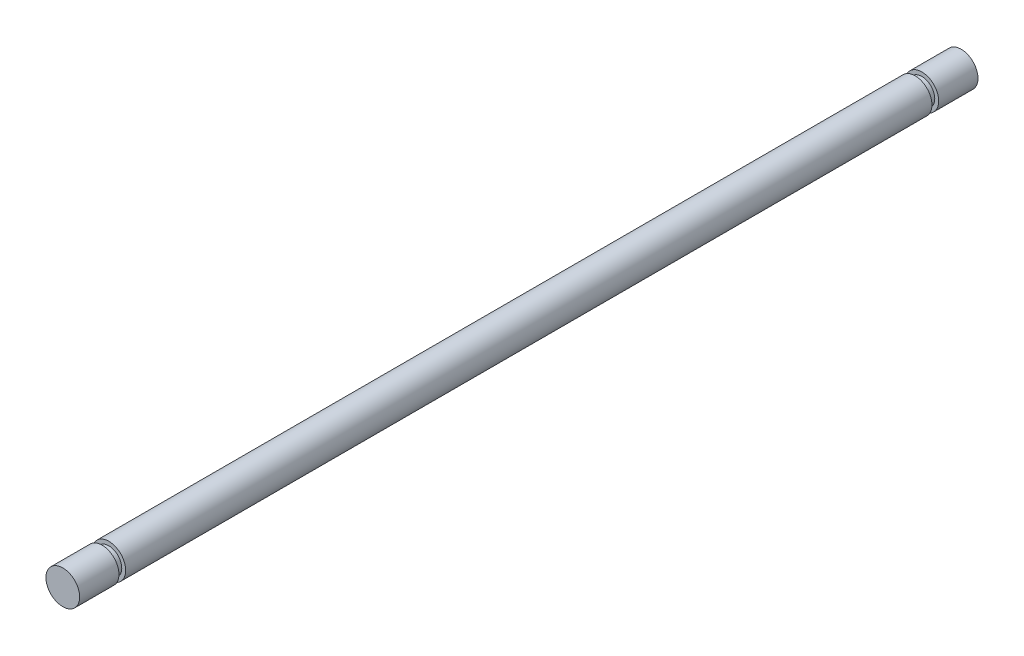
ISO-10303-21;
HEADER;
FILE_DESCRIPTION(('STEP AP214'),'2;1');
FILE_NAME('part.step','',(''),(''),'','','');
FILE_SCHEMA(('AUTOMOTIVE_DESIGN { 1 0 10303 214 1 1 1 1 }'));
ENDSEC;
DATA;
#1=APPLICATION_CONTEXT('core data for automotive mechanical design processes');
#2=APPLICATION_PROTOCOL_DEFINITION('international standard','automotive_design',2000,#1);
#3=PRODUCT_CONTEXT('',#1,'mechanical');
#4=PRODUCT('Part','Part','',(#3));
#5=PRODUCT_RELATED_PRODUCT_CATEGORY('part','',(#4));
#6=PRODUCT_DEFINITION_FORMATION('','',#4);
#7=PRODUCT_DEFINITION_CONTEXT('part definition',#1,'design');
#8=PRODUCT_DEFINITION('design','',#6,#7);
#9=PRODUCT_DEFINITION_SHAPE('','',#8);
#10=(LENGTH_UNIT() NAMED_UNIT(*) SI_UNIT(.MILLI.,.METRE.));
#11=(NAMED_UNIT(*) PLANE_ANGLE_UNIT() SI_UNIT($,.RADIAN.));
#12=(NAMED_UNIT(*) SI_UNIT($,.STERADIAN.) SOLID_ANGLE_UNIT());
#13=UNCERTAINTY_MEASURE_WITH_UNIT(LENGTH_MEASURE(1.E-05),#10,'distance_accuracy_value','');
#14=(GEOMETRIC_REPRESENTATION_CONTEXT(3) GLOBAL_UNCERTAINTY_ASSIGNED_CONTEXT((#13)) GLOBAL_UNIT_ASSIGNED_CONTEXT((#10,
#11,#12)) REPRESENTATION_CONTEXT('',''));
#15=CARTESIAN_POINT('',(0.,0.,0.));
#16=DIRECTION('',(0.,0.,1.));
#17=DIRECTION('',(1.,0.,0.));
#18=AXIS2_PLACEMENT_3D('',#15,#16,#17);
#19=CARTESIAN_POINT('',(0.,0.,3.5));
#20=DIRECTION('',(0.,0.,-1.));
#21=DIRECTION('',(-1.,0.,0.));
#22=AXIS2_PLACEMENT_3D('',#19,#20,#21);
#23=CYLINDRICAL_SURFACE('',#22,1.5);
#24=CARTESIAN_POINT('',(0.,0.,3.5));
#25=DIRECTION('',(0.,0.,1.));
#26=DIRECTION('',(1.,0.,0.));
#27=AXIS2_PLACEMENT_3D('',#24,#25,#26);
#28=CIRCLE('',#27,1.5);
#29=CARTESIAN_POINT('',(1.5,0.,3.5));
#30=VERTEX_POINT('',#29);
#31=EDGE_CURVE('E59',#30,#30,#28,.T.);
#32=ORIENTED_EDGE('',*,*,#31,.F.);
#33=EDGE_LOOP('',(#32));
#34=FACE_BOUND('',#33,.T.);
#35=CARTESIAN_POINT('',(0.,0.,0.));
#36=DIRECTION('',(0.,0.,1.));
#37=DIRECTION('',(1.,0.,0.));
#38=AXIS2_PLACEMENT_3D('',#35,#36,#37);
#39=CIRCLE('',#38,1.5);
#40=CARTESIAN_POINT('',(1.5,0.,0.));
#41=VERTEX_POINT('',#40);
#42=EDGE_CURVE('E47',#41,#41,#39,.T.);
#43=ORIENTED_EDGE('',*,*,#42,.T.);
#44=EDGE_LOOP('',(#43));
#45=FACE_BOUND('',#44,.T.);
#46=ADVANCED_FACE('F44',(#34,#45),#23,.T.);
#47=CARTESIAN_POINT('',(0.,0.,3.5));
#48=DIRECTION('',(0.,0.,1.));
#49=DIRECTION('',(1.,0.,0.));
#50=AXIS2_PLACEMENT_3D('',#47,#48,#49);
#51=PLANE('',#50);
#52=CARTESIAN_POINT('',(0.,0.,3.5));
#53=DIRECTION('',(0.,0.,1.));
#54=DIRECTION('',(1.,0.,0.));
#55=AXIS2_PLACEMENT_3D('',#52,#53,#54);
#56=CIRCLE('',#55,1.15);
#57=CARTESIAN_POINT('',(1.15,0.,3.5));
#58=VERTEX_POINT('',#57);
#59=EDGE_CURVE('E52',#58,#58,#56,.T.);
#60=ORIENTED_EDGE('',*,*,#59,.F.);
#61=EDGE_LOOP('',(#60));
#62=FACE_BOUND('',#61,.T.);
#63=ORIENTED_EDGE('',*,*,#31,.T.);
#64=EDGE_LOOP('',(#63));
#65=FACE_BOUND('',#64,.T.);
#66=ADVANCED_FACE('F81',(#62,#65),#51,.T.);
#67=CARTESIAN_POINT('',(0.,0.,0.));
#68=DIRECTION('',(0.,0.,1.));
#69=DIRECTION('',(1.,0.,0.));
#70=AXIS2_PLACEMENT_3D('',#67,#68,#69);
#71=PLANE('',#70);
#72=ORIENTED_EDGE('',*,*,#42,.F.);
#73=EDGE_LOOP('',(#72));
#74=FACE_BOUND('',#73,.T.);
#75=ADVANCED_FACE('F79',(#74),#71,.F.);
#76=CARTESIAN_POINT('',(0.,0.,4.1));
#77=DIRECTION('',(0.,0.,-1.));
#78=DIRECTION('',(-1.,0.,0.));
#79=AXIS2_PLACEMENT_3D('',#76,#77,#78);
#80=CYLINDRICAL_SURFACE('',#79,1.15);
#81=CARTESIAN_POINT('',(0.,0.,4.1));
#82=DIRECTION('',(0.,0.,1.));
#83=DIRECTION('',(1.,0.,0.));
#84=AXIS2_PLACEMENT_3D('',#81,#82,#83);
#85=CIRCLE('',#84,1.15);
#86=CARTESIAN_POINT('',(1.15,0.,4.1));
#87=VERTEX_POINT('',#86);
#88=EDGE_CURVE('E69',#87,#87,#85,.T.);
#89=ORIENTED_EDGE('',*,*,#88,.F.);
#90=EDGE_LOOP('',(#89));
#91=FACE_BOUND('',#90,.T.);
#92=ORIENTED_EDGE('',*,*,#59,.T.);
#93=EDGE_LOOP('',(#92));
#94=FACE_BOUND('',#93,.T.);
#95=ADVANCED_FACE('F84',(#91,#94),#80,.T.);
#96=CARTESIAN_POINT('',(0.,0.,75.9));
#97=DIRECTION('',(0.,0.,-1.));
#98=DIRECTION('',(-1.,0.,0.));
#99=AXIS2_PLACEMENT_3D('',#96,#97,#98);
#100=CYLINDRICAL_SURFACE('',#99,1.5);
#101=CARTESIAN_POINT('',(0.,0.,75.9));
#102=DIRECTION('',(0.,0.,1.));
#103=DIRECTION('',(1.,0.,0.));
#104=AXIS2_PLACEMENT_3D('',#101,#102,#103);
#105=CIRCLE('',#104,1.5);
#106=CARTESIAN_POINT('',(1.5,0.,75.9));
#107=VERTEX_POINT('',#106);
#108=EDGE_CURVE('E63',#107,#107,#105,.T.);
#109=ORIENTED_EDGE('',*,*,#108,.F.);
#110=EDGE_LOOP('',(#109));
#111=FACE_BOUND('',#110,.T.);
#112=CARTESIAN_POINT('',(0.,0.,4.1));
#113=DIRECTION('',(0.,0.,1.));
#114=DIRECTION('',(1.,0.,0.));
#115=AXIS2_PLACEMENT_3D('',#112,#113,#114);
#116=CIRCLE('',#115,1.5);
#117=CARTESIAN_POINT('',(1.5,0.,4.1));
#118=VERTEX_POINT('',#117);
#119=EDGE_CURVE('E70',#118,#118,#116,.T.);
#120=ORIENTED_EDGE('',*,*,#119,.T.);
#121=EDGE_LOOP('',(#120));
#122=FACE_BOUND('',#121,.T.);
#123=ADVANCED_FACE('F87',(#111,#122),#100,.T.);
#124=CARTESIAN_POINT('',(0.,0.,75.9));
#125=DIRECTION('',(0.,0.,1.));
#126=DIRECTION('',(1.,0.,0.));
#127=AXIS2_PLACEMENT_3D('',#124,#125,#126);
#128=PLANE('',#127);
#129=CARTESIAN_POINT('',(0.,0.,75.9));
#130=DIRECTION('',(0.,0.,1.));
#131=DIRECTION('',(1.,0.,0.));
#132=AXIS2_PLACEMENT_3D('',#129,#130,#131);
#133=CIRCLE('',#132,1.15);
#134=CARTESIAN_POINT('',(1.15,0.,75.9));
#135=VERTEX_POINT('',#134);
#136=EDGE_CURVE('E10',#135,#135,#133,.T.);
#137=ORIENTED_EDGE('',*,*,#136,.F.);
#138=EDGE_LOOP('',(#137));
#139=FACE_BOUND('',#138,.T.);
#140=ORIENTED_EDGE('',*,*,#108,.T.);
#141=EDGE_LOOP('',(#140));
#142=FACE_BOUND('',#141,.T.);
#143=ADVANCED_FACE('F113',(#139,#142),#128,.T.);
#144=CARTESIAN_POINT('',(0.,0.,4.1));
#145=DIRECTION('',(0.,0.,1.));
#146=DIRECTION('',(1.,0.,0.));
#147=AXIS2_PLACEMENT_3D('',#144,#145,#146);
#148=PLANE('',#147);
#149=ORIENTED_EDGE('',*,*,#88,.T.);
#150=EDGE_LOOP('',(#149));
#151=FACE_BOUND('',#150,.T.);
#152=ORIENTED_EDGE('',*,*,#119,.F.);
#153=EDGE_LOOP('',(#152));
#154=FACE_BOUND('',#153,.T.);
#155=ADVANCED_FACE('F119',(#151,#154),#148,.F.);
#156=CARTESIAN_POINT('',(0.,0.,76.5));
#157=DIRECTION('',(0.,0.,-1.));
#158=DIRECTION('',(-1.,0.,0.));
#159=AXIS2_PLACEMENT_3D('',#156,#157,#158);
#160=CYLINDRICAL_SURFACE('',#159,1.15);
#161=CARTESIAN_POINT('',(0.,0.,76.5));
#162=DIRECTION('',(0.,0.,1.));
#163=DIRECTION('',(1.,0.,0.));
#164=AXIS2_PLACEMENT_3D('',#161,#162,#163);
#165=CIRCLE('',#164,1.15);
#166=CARTESIAN_POINT('',(1.15,0.,76.5));
#167=VERTEX_POINT('',#166);
#168=EDGE_CURVE('E61',#167,#167,#165,.T.);
#169=ORIENTED_EDGE('',*,*,#168,.F.);
#170=EDGE_LOOP('',(#169));
#171=FACE_BOUND('',#170,.T.);
#172=ORIENTED_EDGE('',*,*,#136,.T.);
#173=EDGE_LOOP('',(#172));
#174=FACE_BOUND('',#173,.T.);
#175=ADVANCED_FACE('F126',(#171,#174),#160,.T.);
#176=CARTESIAN_POINT('',(0.,0.,80.));
#177=DIRECTION('',(0.,0.,-1.));
#178=DIRECTION('',(-1.,0.,0.));
#179=AXIS2_PLACEMENT_3D('',#176,#177,#178);
#180=CYLINDRICAL_SURFACE('',#179,1.5);
#181=CARTESIAN_POINT('',(0.,0.,80.));
#182=DIRECTION('',(0.,0.,1.));
#183=DIRECTION('',(1.,0.,0.));
#184=AXIS2_PLACEMENT_3D('',#181,#182,#183);
#185=CIRCLE('',#184,1.5);
#186=CARTESIAN_POINT('',(1.5,0.,80.));
#187=VERTEX_POINT('',#186);
#188=EDGE_CURVE('E170',#187,#187,#185,.T.);
#189=ORIENTED_EDGE('',*,*,#188,.F.);
#190=EDGE_LOOP('',(#189));
#191=FACE_BOUND('',#190,.T.);
#192=CARTESIAN_POINT('',(0.,0.,76.5));
#193=DIRECTION('',(0.,0.,1.));
#194=DIRECTION('',(1.,0.,0.));
#195=AXIS2_PLACEMENT_3D('',#192,#193,#194);
#196=CIRCLE('',#195,1.5);
#197=CARTESIAN_POINT('',(1.5,0.,76.5));
#198=VERTEX_POINT('',#197);
#199=EDGE_CURVE('E164',#198,#198,#196,.T.);
#200=ORIENTED_EDGE('',*,*,#199,.T.);
#201=EDGE_LOOP('',(#200));
#202=FACE_BOUND('',#201,.T.);
#203=ADVANCED_FACE('F131',(#191,#202),#180,.T.);
#204=CARTESIAN_POINT('',(0.,0.,80.));
#205=DIRECTION('',(0.,0.,1.));
#206=DIRECTION('',(1.,0.,0.));
#207=AXIS2_PLACEMENT_3D('',#204,#205,#206);
#208=PLANE('',#207);
#209=ORIENTED_EDGE('',*,*,#188,.T.);
#210=EDGE_LOOP('',(#209));
#211=FACE_BOUND('',#210,.T.);
#212=ADVANCED_FACE('F139',(#211),#208,.T.);
#213=CARTESIAN_POINT('',(0.,0.,76.5));
#214=DIRECTION('',(0.,0.,1.));
#215=DIRECTION('',(1.,0.,0.));
#216=AXIS2_PLACEMENT_3D('',#213,#214,#215);
#217=PLANE('',#216);
#218=ORIENTED_EDGE('',*,*,#168,.T.);
#219=EDGE_LOOP('',(#218));
#220=FACE_BOUND('',#219,.T.);
#221=ORIENTED_EDGE('',*,*,#199,.F.);
#222=EDGE_LOOP('',(#221));
#223=FACE_BOUND('',#222,.T.);
#224=ADVANCED_FACE('F100',(#220,#223),#217,.F.);
#225=CLOSED_SHELL('',(#46,#66,#75,#95,#123,#143,#155,#175,#203,#212,#224));
#226=MANIFOLD_SOLID_BREP('B2',#225);
#227=ADVANCED_BREP_SHAPE_REPRESENTATION('',(#18,#226),#14);
#228=SHAPE_DEFINITION_REPRESENTATION(#9,#227);
ENDSEC;
END-ISO-10303-21;
